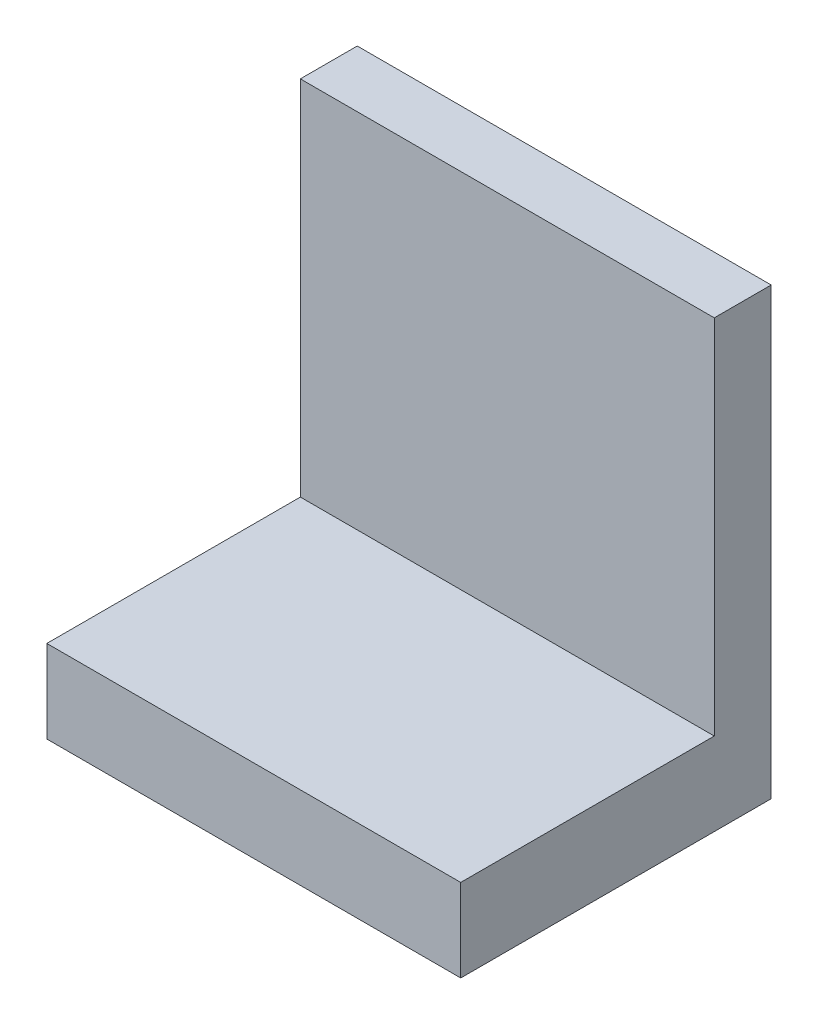
ISO-10303-21;
HEADER;
FILE_DESCRIPTION(('STEP AP214'),'2;1');
FILE_NAME('part.step','',(''),(''),'','','');
FILE_SCHEMA(('AUTOMOTIVE_DESIGN { 1 0 10303 214 1 1 1 1 }'));
ENDSEC;
DATA;
#1=APPLICATION_CONTEXT('core data for automotive mechanical design processes');
#2=APPLICATION_PROTOCOL_DEFINITION('international standard','automotive_design',2000,#1);
#3=PRODUCT_CONTEXT('',#1,'mechanical');
#4=PRODUCT('Part','Part','',(#3));
#5=PRODUCT_RELATED_PRODUCT_CATEGORY('part','',(#4));
#6=PRODUCT_DEFINITION_FORMATION('','',#4);
#7=PRODUCT_DEFINITION_CONTEXT('part definition',#1,'design');
#8=PRODUCT_DEFINITION('design','',#6,#7);
#9=PRODUCT_DEFINITION_SHAPE('','',#8);
#10=(LENGTH_UNIT() NAMED_UNIT(*) SI_UNIT(.MILLI.,.METRE.));
#11=(NAMED_UNIT(*) PLANE_ANGLE_UNIT() SI_UNIT($,.RADIAN.));
#12=(NAMED_UNIT(*) SI_UNIT($,.STERADIAN.) SOLID_ANGLE_UNIT());
#13=UNCERTAINTY_MEASURE_WITH_UNIT(LENGTH_MEASURE(1.E-05),#10,'distance_accuracy_value','');
#14=(GEOMETRIC_REPRESENTATION_CONTEXT(3) GLOBAL_UNCERTAINTY_ASSIGNED_CONTEXT((#13)) GLOBAL_UNIT_ASSIGNED_CONTEXT((#10,
#11,#12)) REPRESENTATION_CONTEXT('',''));
#15=CARTESIAN_POINT('',(0.,0.,0.));
#16=DIRECTION('',(0.,0.,1.));
#17=DIRECTION('',(1.,0.,0.));
#18=AXIS2_PLACEMENT_3D('',#15,#16,#17);
#19=CARTESIAN_POINT('',(0.,1.6,0.));
#20=DIRECTION('',(0.,-1.,0.));
#21=DIRECTION('',(0.,0.,-1.));
#22=AXIS2_PLACEMENT_3D('',#19,#20,#21);
#23=PLANE('',#22);
#24=DIRECTION('',(1.,0.,0.));
#25=VECTOR('',#24,1.);
#26=CARTESIAN_POINT('',(-3.99999999999998,1.6,-1.90000000000002));
#27=LINE('',#26,#25);
#28=CARTESIAN_POINT('',(-4.,1.6,-1.90000000000002));
#29=VERTEX_POINT('',#28);
#30=CARTESIAN_POINT('',(4.00000000000002,1.6,-1.90000000000002));
#31=VERTEX_POINT('',#30);
#32=EDGE_CURVE('E48',#29,#31,#27,.T.);
#33=ORIENTED_EDGE('',*,*,#32,.F.);
#34=DIRECTION('',(0.,0.,1.));
#35=VECTOR('',#34,1.);
#36=CARTESIAN_POINT('',(-4.,1.6,3.));
#37=LINE('',#36,#35);
#38=CARTESIAN_POINT('',(-4.,1.6,3.));
#39=VERTEX_POINT('',#38);
#40=EDGE_CURVE('E133',#29,#39,#37,.T.);
#41=ORIENTED_EDGE('',*,*,#40,.T.);
#42=DIRECTION('',(1.,0.,0.));
#43=VECTOR('',#42,1.);
#44=CARTESIAN_POINT('',(-4.,1.6,3.));
#45=LINE('',#44,#43);
#46=CARTESIAN_POINT('',(4.,1.6,3.));
#47=VERTEX_POINT('',#46);
#48=EDGE_CURVE('E54',#39,#47,#45,.T.);
#49=ORIENTED_EDGE('',*,*,#48,.T.);
#50=DIRECTION('',(0.,0.,-1.));
#51=VECTOR('',#50,1.);
#52=CARTESIAN_POINT('',(4.,1.6,3.));
#53=LINE('',#52,#51);
#54=EDGE_CURVE('E83',#47,#31,#53,.T.);
#55=ORIENTED_EDGE('',*,*,#54,.T.);
#56=EDGE_LOOP('',(#33,#41,#49,#55));
#57=FACE_BOUND('',#56,.T.);
#58=ADVANCED_FACE('F33',(#57),#23,.F.);
#59=CARTESIAN_POINT('',(4.,1.6,3.));
#60=DIRECTION('',(-1.,0.,0.));
#61=DIRECTION('',(0.,0.,1.));
#62=AXIS2_PLACEMENT_3D('',#59,#60,#61);
#63=PLANE('',#62);
#64=DIRECTION('',(0.,0.,-1.));
#65=VECTOR('',#64,1.);
#66=CARTESIAN_POINT('',(4.,0.,3.));
#67=LINE('',#66,#65);
#68=CARTESIAN_POINT('',(4.,0.,3.));
#69=VERTEX_POINT('',#68);
#70=CARTESIAN_POINT('',(4.,0.,-3.));
#71=VERTEX_POINT('',#70);
#72=EDGE_CURVE('E89',#69,#71,#67,.T.);
#73=ORIENTED_EDGE('',*,*,#72,.T.);
#74=DIRECTION('',(0.,-1.,0.));
#75=VECTOR('',#74,1.);
#76=CARTESIAN_POINT('',(4.,1.6,-3.));
#77=LINE('',#76,#75);
#78=CARTESIAN_POINT('',(4.,8.6,-3.));
#79=VERTEX_POINT('',#78);
#80=EDGE_CURVE('E11',#79,#71,#77,.T.);
#81=ORIENTED_EDGE('',*,*,#80,.F.);
#82=DIRECTION('',(0.,0.,-1.));
#83=VECTOR('',#82,1.);
#84=CARTESIAN_POINT('',(4.,8.6,-3.));
#85=LINE('',#84,#83);
#86=CARTESIAN_POINT('',(4.00000000000002,8.6,-1.90000000000002));
#87=VERTEX_POINT('',#86);
#88=EDGE_CURVE('E125',#87,#79,#85,.T.);
#89=ORIENTED_EDGE('',*,*,#88,.F.);
#90=DIRECTION('',(0.,-1.,0.));
#91=VECTOR('',#90,1.);
#92=CARTESIAN_POINT('',(4.00000000000002,8.6,-1.90000000000002));
#93=LINE('',#92,#91);
#94=EDGE_CURVE('E98',#87,#31,#93,.T.);
#95=ORIENTED_EDGE('',*,*,#94,.T.);
#96=ORIENTED_EDGE('',*,*,#54,.F.);
#97=DIRECTION('',(0.,-1.,0.));
#98=VECTOR('',#97,1.);
#99=CARTESIAN_POINT('',(4.,1.6,3.));
#100=LINE('',#99,#98);
#101=EDGE_CURVE('E76',#47,#69,#100,.T.);
#102=ORIENTED_EDGE('',*,*,#101,.T.);
#103=EDGE_LOOP('',(#73,#81,#89,#95,#96,#102));
#104=FACE_BOUND('',#103,.T.);
#105=ADVANCED_FACE('F35',(#104),#63,.F.);
#106=CARTESIAN_POINT('',(-4.,1.6,-3.));
#107=DIRECTION('',(0.,0.,1.));
#108=DIRECTION('',(1.,0.,0.));
#109=AXIS2_PLACEMENT_3D('',#106,#107,#108);
#110=PLANE('',#109);
#111=DIRECTION('',(-1.,0.,0.));
#112=VECTOR('',#111,1.);
#113=CARTESIAN_POINT('',(-4.,0.,-3.));
#114=LINE('',#113,#112);
#115=CARTESIAN_POINT('',(-4.,0.,-3.));
#116=VERTEX_POINT('',#115);
#117=EDGE_CURVE('E93',#71,#116,#114,.T.);
#118=ORIENTED_EDGE('',*,*,#117,.T.);
#119=DIRECTION('',(0.,-1.,0.));
#120=VECTOR('',#119,1.);
#121=CARTESIAN_POINT('',(-4.,1.6,-3.));
#122=LINE('',#121,#120);
#123=CARTESIAN_POINT('',(-4.,8.6,-3.));
#124=VERTEX_POINT('',#123);
#125=EDGE_CURVE('E41',#124,#116,#122,.T.);
#126=ORIENTED_EDGE('',*,*,#125,.F.);
#127=DIRECTION('',(-1.,0.,0.));
#128=VECTOR('',#127,1.);
#129=CARTESIAN_POINT('',(-4.,8.6,-3.));
#130=LINE('',#129,#128);
#131=EDGE_CURVE('E117',#79,#124,#130,.T.);
#132=ORIENTED_EDGE('',*,*,#131,.F.);
#133=ORIENTED_EDGE('',*,*,#80,.T.);
#134=EDGE_LOOP('',(#118,#126,#132,#133));
#135=FACE_BOUND('',#134,.T.);
#136=ADVANCED_FACE('F115',(#135),#110,.F.);
#137=CARTESIAN_POINT('',(-4.,1.6,3.));
#138=DIRECTION('',(1.,0.,0.));
#139=DIRECTION('',(0.,0.,-1.));
#140=AXIS2_PLACEMENT_3D('',#137,#138,#139);
#141=PLANE('',#140);
#142=DIRECTION('',(0.,0.,1.));
#143=VECTOR('',#142,1.);
#144=CARTESIAN_POINT('',(-4.,0.,3.));
#145=LINE('',#144,#143);
#146=CARTESIAN_POINT('',(-4.,0.,3.));
#147=VERTEX_POINT('',#146);
#148=EDGE_CURVE('E84',#116,#147,#145,.T.);
#149=ORIENTED_EDGE('',*,*,#148,.T.);
#150=DIRECTION('',(0.,-1.,0.));
#151=VECTOR('',#150,1.);
#152=CARTESIAN_POINT('',(-4.,1.6,3.));
#153=LINE('',#152,#151);
#154=EDGE_CURVE('E79',#39,#147,#153,.T.);
#155=ORIENTED_EDGE('',*,*,#154,.F.);
#156=ORIENTED_EDGE('',*,*,#40,.F.);
#157=DIRECTION('',(0.,-1.,0.));
#158=VECTOR('',#157,1.);
#159=CARTESIAN_POINT('',(-3.99999999999998,8.6,-1.90000000000002));
#160=LINE('',#159,#158);
#161=CARTESIAN_POINT('',(-3.99999999999998,8.6,-1.90000000000002));
#162=VERTEX_POINT('',#161);
#163=EDGE_CURVE('E94',#162,#29,#160,.T.);
#164=ORIENTED_EDGE('',*,*,#163,.F.);
#165=DIRECTION('',(0.,0.,1.));
#166=VECTOR('',#165,1.);
#167=CARTESIAN_POINT('',(-4.,8.6,-3.));
#168=LINE('',#167,#166);
#169=EDGE_CURVE('E111',#124,#162,#168,.T.);
#170=ORIENTED_EDGE('',*,*,#169,.F.);
#171=ORIENTED_EDGE('',*,*,#125,.T.);
#172=EDGE_LOOP('',(#149,#155,#156,#164,#170,#171));
#173=FACE_BOUND('',#172,.T.);
#174=ADVANCED_FACE('F108',(#173),#141,.F.);
#175=CARTESIAN_POINT('',(-4.,1.6,3.));
#176=DIRECTION('',(0.,0.,-1.));
#177=DIRECTION('',(-1.,0.,0.));
#178=AXIS2_PLACEMENT_3D('',#175,#176,#177);
#179=PLANE('',#178);
#180=DIRECTION('',(1.,0.,0.));
#181=VECTOR('',#180,1.);
#182=CARTESIAN_POINT('',(-4.,0.,3.));
#183=LINE('',#182,#181);
#184=EDGE_CURVE('E73',#147,#69,#183,.T.);
#185=ORIENTED_EDGE('',*,*,#184,.T.);
#186=ORIENTED_EDGE('',*,*,#101,.F.);
#187=ORIENTED_EDGE('',*,*,#48,.F.);
#188=ORIENTED_EDGE('',*,*,#154,.T.);
#189=EDGE_LOOP('',(#185,#186,#187,#188));
#190=FACE_BOUND('',#189,.T.);
#191=ADVANCED_FACE('F75',(#190),#179,.F.);
#192=CARTESIAN_POINT('',(0.,0.,0.));
#193=DIRECTION('',(0.,-1.,0.));
#194=DIRECTION('',(0.,0.,-1.));
#195=AXIS2_PLACEMENT_3D('',#192,#193,#194);
#196=PLANE('',#195);
#197=ORIENTED_EDGE('',*,*,#72,.F.);
#198=ORIENTED_EDGE('',*,*,#184,.F.);
#199=ORIENTED_EDGE('',*,*,#148,.F.);
#200=ORIENTED_EDGE('',*,*,#117,.F.);
#201=EDGE_LOOP('',(#197,#198,#199,#200));
#202=FACE_BOUND('',#201,.T.);
#203=ADVANCED_FACE('F92',(#202),#196,.T.);
#204=CARTESIAN_POINT('',(-3.99999999999998,8.6,-1.90000000000002));
#205=DIRECTION('',(0.,0.,-1.));
#206=DIRECTION('',(-1.,0.,0.));
#207=AXIS2_PLACEMENT_3D('',#204,#205,#206);
#208=PLANE('',#207);
#209=ORIENTED_EDGE('',*,*,#32,.T.);
#210=ORIENTED_EDGE('',*,*,#94,.F.);
#211=DIRECTION('',(1.,0.,0.));
#212=VECTOR('',#211,1.);
#213=CARTESIAN_POINT('',(-3.99999999999998,8.6,-1.90000000000002));
#214=LINE('',#213,#212);
#215=EDGE_CURVE('E128',#162,#87,#214,.T.);
#216=ORIENTED_EDGE('',*,*,#215,.F.);
#217=ORIENTED_EDGE('',*,*,#163,.T.);
#218=EDGE_LOOP('',(#209,#210,#216,#217));
#219=FACE_BOUND('',#218,.T.);
#220=ADVANCED_FACE('F136',(#219),#208,.F.);
#221=CARTESIAN_POINT('',(0.,8.6,0.));
#222=DIRECTION('',(0.,1.,0.));
#223=DIRECTION('',(0.,0.,1.));
#224=AXIS2_PLACEMENT_3D('',#221,#222,#223);
#225=PLANE('',#224);
#226=ORIENTED_EDGE('',*,*,#169,.T.);
#227=ORIENTED_EDGE('',*,*,#215,.T.);
#228=ORIENTED_EDGE('',*,*,#88,.T.);
#229=ORIENTED_EDGE('',*,*,#131,.T.);
#230=EDGE_LOOP('',(#226,#227,#228,#229));
#231=FACE_BOUND('',#230,.T.);
#232=ADVANCED_FACE('F121',(#231),#225,.T.);
#233=CLOSED_SHELL('',(#58,#105,#136,#174,#191,#203,#220,#232));
#234=MANIFOLD_SOLID_BREP('B2',#233);
#235=ADVANCED_BREP_SHAPE_REPRESENTATION('',(#18,#234),#14);
#236=SHAPE_DEFINITION_REPRESENTATION(#9,#235);
ENDSEC;
END-ISO-10303-21;
